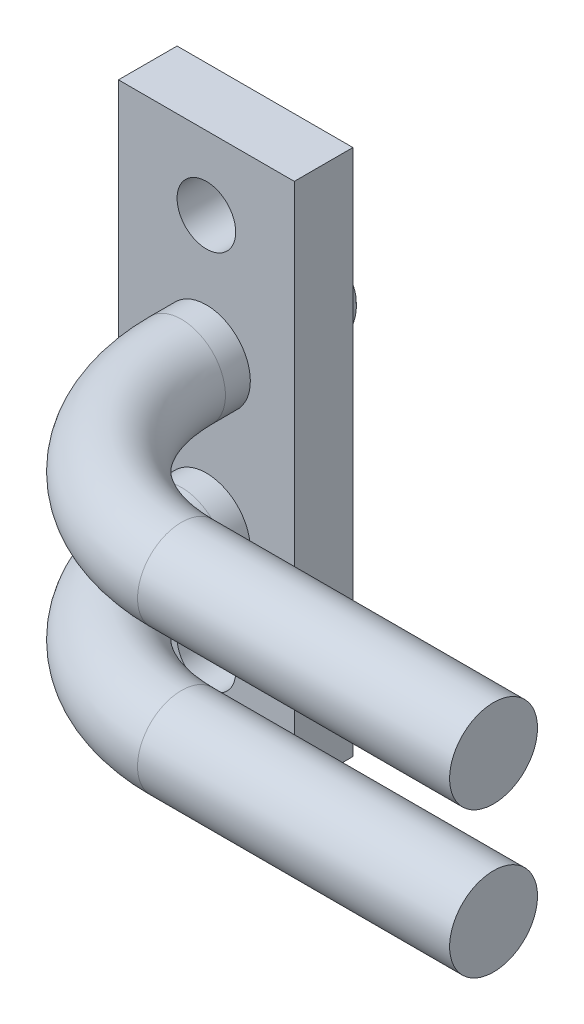
ISO-10303-21;
HEADER;
FILE_DESCRIPTION(('STEP AP214'),'2;1');
FILE_NAME('part.step','',(''),(''),'','','');
FILE_SCHEMA(('AUTOMOTIVE_DESIGN { 1 0 10303 214 1 1 1 1 }'));
ENDSEC;
DATA;
#1=APPLICATION_CONTEXT('core data for automotive mechanical design processes');
#2=APPLICATION_PROTOCOL_DEFINITION('international standard','automotive_design',2000,#1);
#3=PRODUCT_CONTEXT('',#1,'mechanical');
#4=PRODUCT('Part','Part','',(#3));
#5=PRODUCT_RELATED_PRODUCT_CATEGORY('part','',(#4));
#6=PRODUCT_DEFINITION_FORMATION('','',#4);
#7=PRODUCT_DEFINITION_CONTEXT('part definition',#1,'design');
#8=PRODUCT_DEFINITION('design','',#6,#7);
#9=PRODUCT_DEFINITION_SHAPE('','',#8);
#10=(LENGTH_UNIT() NAMED_UNIT(*) SI_UNIT(.MILLI.,.METRE.));
#11=(NAMED_UNIT(*) PLANE_ANGLE_UNIT() SI_UNIT($,.RADIAN.));
#12=(NAMED_UNIT(*) SI_UNIT($,.STERADIAN.) SOLID_ANGLE_UNIT());
#13=UNCERTAINTY_MEASURE_WITH_UNIT(LENGTH_MEASURE(1.E-05),#10,'distance_accuracy_value','');
#14=(GEOMETRIC_REPRESENTATION_CONTEXT(3) GLOBAL_UNCERTAINTY_ASSIGNED_CONTEXT((#13)) GLOBAL_UNIT_ASSIGNED_CONTEXT((#10,
#11,#12)) REPRESENTATION_CONTEXT('',''));
#15=CARTESIAN_POINT('',(0.,0.,0.));
#16=DIRECTION('',(0.,0.,1.));
#17=DIRECTION('',(1.,0.,0.));
#18=AXIS2_PLACEMENT_3D('',#15,#16,#17);
#19=CARTESIAN_POINT('',(3.,9.,2.));
#20=DIRECTION('',(0.,0.,-1.));
#21=DIRECTION('',(-1.,0.,0.));
#22=AXIS2_PLACEMENT_3D('',#19,#20,#21);
#23=PLANE('',#22);
#24=CARTESIAN_POINT('',(0.,-6.5,2.));
#25=DIRECTION('',(0.,0.,1.));
#26=DIRECTION('',(-1.,0.,0.));
#27=AXIS2_PLACEMENT_3D('',#24,#25,#26);
#28=CIRCLE('',#27,1.);
#29=CARTESIAN_POINT('',(-0.999999999999992,-6.5,2.));
#30=VERTEX_POINT('',#29);
#31=EDGE_CURVE('E130',#30,#30,#28,.T.);
#32=ORIENTED_EDGE('',*,*,#31,.F.);
#33=EDGE_LOOP('',(#32));
#34=FACE_BOUND('',#33,.T.);
#35=CARTESIAN_POINT('',(0.,6.5,2.));
#36=DIRECTION('',(0.,0.,1.));
#37=DIRECTION('',(1.,0.,0.));
#38=AXIS2_PLACEMENT_3D('',#35,#36,#37);
#39=CIRCLE('',#38,1.);
#40=CARTESIAN_POINT('',(1.,6.5,2.));
#41=VERTEX_POINT('',#40);
#42=EDGE_CURVE('E119',#41,#41,#39,.T.);
#43=ORIENTED_EDGE('',*,*,#42,.F.);
#44=EDGE_LOOP('',(#43));
#45=FACE_BOUND('',#44,.T.);
#46=CARTESIAN_POINT('',(0.,-2.62,2.));
#47=DIRECTION('',(0.,0.,1.));
#48=DIRECTION('',(1.,0.,0.));
#49=AXIS2_PLACEMENT_3D('',#46,#47,#48);
#50=CIRCLE('',#49,1.5);
#51=CARTESIAN_POINT('',(1.5,-2.62,2.));
#52=VERTEX_POINT('',#51);
#53=EDGE_CURVE('E41',#52,#52,#50,.T.);
#54=ORIENTED_EDGE('',*,*,#53,.F.);
#55=EDGE_LOOP('',(#54));
#56=FACE_BOUND('',#55,.T.);
#57=DIRECTION('',(0.,1.,0.));
#58=VECTOR('',#57,1.);
#59=CARTESIAN_POINT('',(3.,-9.,2.));
#60=LINE('',#59,#58);
#61=CARTESIAN_POINT('',(3.,-9.,2.));
#62=VERTEX_POINT('',#61);
#63=CARTESIAN_POINT('',(3.,9.,2.));
#64=VERTEX_POINT('',#63);
#65=EDGE_CURVE('E86',#62,#64,#60,.T.);
#66=ORIENTED_EDGE('',*,*,#65,.T.);
#67=DIRECTION('',(-1.,0.,0.));
#68=VECTOR('',#67,1.);
#69=CARTESIAN_POINT('',(-3.,9.,2.));
#70=LINE('',#69,#68);
#71=CARTESIAN_POINT('',(-3.,9.,2.));
#72=VERTEX_POINT('',#71);
#73=EDGE_CURVE('E81',#64,#72,#70,.T.);
#74=ORIENTED_EDGE('',*,*,#73,.T.);
#75=DIRECTION('',(0.,-1.,0.));
#76=VECTOR('',#75,1.);
#77=CARTESIAN_POINT('',(-3.,-9.,2.));
#78=LINE('',#77,#76);
#79=CARTESIAN_POINT('',(-3.,-9.,2.));
#80=VERTEX_POINT('',#79);
#81=EDGE_CURVE('E84',#72,#80,#78,.T.);
#82=ORIENTED_EDGE('',*,*,#81,.T.);
#83=DIRECTION('',(1.,0.,0.));
#84=VECTOR('',#83,1.);
#85=CARTESIAN_POINT('',(-3.,-9.,2.));
#86=LINE('',#85,#84);
#87=EDGE_CURVE('E50',#80,#62,#86,.T.);
#88=ORIENTED_EDGE('',*,*,#87,.T.);
#89=EDGE_LOOP('',(#66,#74,#82,#88));
#90=FACE_BOUND('',#89,.T.);
#91=CARTESIAN_POINT('',(0.,2.35,2.));
#92=DIRECTION('',(0.,0.,1.));
#93=DIRECTION('',(1.,0.,0.));
#94=AXIS2_PLACEMENT_3D('',#91,#92,#93);
#95=CIRCLE('',#94,1.5);
#96=CARTESIAN_POINT('',(1.5,2.35,2.));
#97=VERTEX_POINT('',#96);
#98=EDGE_CURVE('E11',#97,#97,#95,.T.);
#99=ORIENTED_EDGE('',*,*,#98,.F.);
#100=EDGE_LOOP('',(#99));
#101=FACE_BOUND('',#100,.T.);
#102=ADVANCED_FACE('F31',(#34,#45,#56,#90,#101),#23,.F.);
#103=CARTESIAN_POINT('',(3.,9.,0.));
#104=DIRECTION('',(0.,0.,-1.));
#105=DIRECTION('',(-1.,0.,0.));
#106=AXIS2_PLACEMENT_3D('',#103,#104,#105);
#107=PLANE('',#106);
#108=CARTESIAN_POINT('',(0.,-6.5,0.));
#109=DIRECTION('',(0.,0.,-1.));
#110=DIRECTION('',(-1.,0.,0.));
#111=AXIS2_PLACEMENT_3D('',#108,#109,#110);
#112=CIRCLE('',#111,1.);
#113=CARTESIAN_POINT('',(-0.999999999999992,-6.5,0.));
#114=VERTEX_POINT('',#113);
#115=EDGE_CURVE('E35',#114,#114,#112,.T.);
#116=ORIENTED_EDGE('',*,*,#115,.F.);
#117=EDGE_LOOP('',(#116));
#118=FACE_BOUND('',#117,.T.);
#119=CARTESIAN_POINT('',(0.,6.5,0.));
#120=DIRECTION('',(0.,0.,-1.));
#121=DIRECTION('',(-1.,0.,0.));
#122=AXIS2_PLACEMENT_3D('',#119,#120,#121);
#123=CIRCLE('',#122,1.);
#124=CARTESIAN_POINT('',(-1.,6.5,0.));
#125=VERTEX_POINT('',#124);
#126=EDGE_CURVE('E116',#125,#125,#123,.T.);
#127=ORIENTED_EDGE('',*,*,#126,.F.);
#128=EDGE_LOOP('',(#127));
#129=FACE_BOUND('',#128,.T.);
#130=CARTESIAN_POINT('',(0.,2.35,0.));
#131=DIRECTION('',(0.,0.,-1.));
#132=DIRECTION('',(-1.,0.,0.));
#133=AXIS2_PLACEMENT_3D('',#130,#131,#132);
#134=CIRCLE('',#133,1.5);
#135=CARTESIAN_POINT('',(-1.5,2.35,0.));
#136=VERTEX_POINT('',#135);
#137=EDGE_CURVE('E104',#136,#136,#134,.T.);
#138=ORIENTED_EDGE('',*,*,#137,.F.);
#139=EDGE_LOOP('',(#138));
#140=FACE_BOUND('',#139,.T.);
#141=DIRECTION('',(0.,1.,0.));
#142=VECTOR('',#141,1.);
#143=CARTESIAN_POINT('',(3.,-9.,0.));
#144=LINE('',#143,#142);
#145=CARTESIAN_POINT('',(3.,-9.,0.));
#146=VERTEX_POINT('',#145);
#147=CARTESIAN_POINT('',(3.,9.,0.));
#148=VERTEX_POINT('',#147);
#149=EDGE_CURVE('E101',#146,#148,#144,.T.);
#150=ORIENTED_EDGE('',*,*,#149,.F.);
#151=DIRECTION('',(1.,0.,0.));
#152=VECTOR('',#151,1.);
#153=CARTESIAN_POINT('',(-3.,-9.,0.));
#154=LINE('',#153,#152);
#155=CARTESIAN_POINT('',(-3.,-9.,0.));
#156=VERTEX_POINT('',#155);
#157=EDGE_CURVE('E73',#156,#146,#154,.T.);
#158=ORIENTED_EDGE('',*,*,#157,.F.);
#159=DIRECTION('',(0.,-1.,0.));
#160=VECTOR('',#159,1.);
#161=CARTESIAN_POINT('',(-3.,-9.,0.));
#162=LINE('',#161,#160);
#163=CARTESIAN_POINT('',(-3.,9.,0.));
#164=VERTEX_POINT('',#163);
#165=EDGE_CURVE('E67',#164,#156,#162,.T.);
#166=ORIENTED_EDGE('',*,*,#165,.F.);
#167=DIRECTION('',(-1.,0.,0.));
#168=VECTOR('',#167,1.);
#169=CARTESIAN_POINT('',(-3.,9.,0.));
#170=LINE('',#169,#168);
#171=EDGE_CURVE('E91',#148,#164,#170,.T.);
#172=ORIENTED_EDGE('',*,*,#171,.F.);
#173=EDGE_LOOP('',(#150,#158,#166,#172));
#174=FACE_BOUND('',#173,.T.);
#175=CARTESIAN_POINT('',(0.,-2.62,0.));
#176=DIRECTION('',(0.,0.,-1.));
#177=DIRECTION('',(-1.,0.,0.));
#178=AXIS2_PLACEMENT_3D('',#175,#176,#177);
#179=CIRCLE('',#178,1.5);
#180=CARTESIAN_POINT('',(-1.5,-2.62,0.));
#181=VERTEX_POINT('',#180);
#182=EDGE_CURVE('E149',#181,#181,#179,.T.);
#183=ORIENTED_EDGE('',*,*,#182,.F.);
#184=EDGE_LOOP('',(#183));
#185=FACE_BOUND('',#184,.T.);
#186=ADVANCED_FACE('F157',(#118,#129,#140,#174,#185),#107,.T.);
#187=CARTESIAN_POINT('',(3.,-9.,2.));
#188=DIRECTION('',(-1.,0.,0.));
#189=DIRECTION('',(0.,0.,1.));
#190=AXIS2_PLACEMENT_3D('',#187,#188,#189);
#191=PLANE('',#190);
#192=ORIENTED_EDGE('',*,*,#149,.T.);
#193=DIRECTION('',(0.,0.,-1.));
#194=VECTOR('',#193,1.);
#195=CARTESIAN_POINT('',(3.,9.,2.));
#196=LINE('',#195,#194);
#197=EDGE_CURVE('E92',#64,#148,#196,.T.);
#198=ORIENTED_EDGE('',*,*,#197,.F.);
#199=ORIENTED_EDGE('',*,*,#65,.F.);
#200=DIRECTION('',(0.,0.,-1.));
#201=VECTOR('',#200,1.);
#202=CARTESIAN_POINT('',(3.,-9.,2.));
#203=LINE('',#202,#201);
#204=EDGE_CURVE('E97',#62,#146,#203,.T.);
#205=ORIENTED_EDGE('',*,*,#204,.T.);
#206=EDGE_LOOP('',(#192,#198,#199,#205));
#207=FACE_BOUND('',#206,.T.);
#208=ADVANCED_FACE('F160',(#207),#191,.F.);
#209=CARTESIAN_POINT('',(-3.,9.,2.));
#210=DIRECTION('',(0.,-1.,0.));
#211=DIRECTION('',(0.,0.,-1.));
#212=AXIS2_PLACEMENT_3D('',#209,#210,#211);
#213=PLANE('',#212);
#214=ORIENTED_EDGE('',*,*,#171,.T.);
#215=DIRECTION('',(0.,0.,-1.));
#216=VECTOR('',#215,1.);
#217=CARTESIAN_POINT('',(-3.,9.,2.));
#218=LINE('',#217,#216);
#219=EDGE_CURVE('E89',#72,#164,#218,.T.);
#220=ORIENTED_EDGE('',*,*,#219,.F.);
#221=ORIENTED_EDGE('',*,*,#73,.F.);
#222=ORIENTED_EDGE('',*,*,#197,.T.);
#223=EDGE_LOOP('',(#214,#220,#221,#222));
#224=FACE_BOUND('',#223,.T.);
#225=ADVANCED_FACE('F90',(#224),#213,.F.);
#226=CARTESIAN_POINT('',(-3.,-9.,2.));
#227=DIRECTION('',(1.,0.,0.));
#228=DIRECTION('',(0.,0.,-1.));
#229=AXIS2_PLACEMENT_3D('',#226,#227,#228);
#230=PLANE('',#229);
#231=ORIENTED_EDGE('',*,*,#165,.T.);
#232=DIRECTION('',(0.,0.,-1.));
#233=VECTOR('',#232,1.);
#234=CARTESIAN_POINT('',(-3.,-9.,2.));
#235=LINE('',#234,#233);
#236=EDGE_CURVE('E93',#80,#156,#235,.T.);
#237=ORIENTED_EDGE('',*,*,#236,.F.);
#238=ORIENTED_EDGE('',*,*,#81,.F.);
#239=ORIENTED_EDGE('',*,*,#219,.T.);
#240=EDGE_LOOP('',(#231,#237,#238,#239));
#241=FACE_BOUND('',#240,.T.);
#242=ADVANCED_FACE('F95',(#241),#230,.F.);
#243=CARTESIAN_POINT('',(-3.,-9.,2.));
#244=DIRECTION('',(0.,1.,0.));
#245=DIRECTION('',(0.,0.,1.));
#246=AXIS2_PLACEMENT_3D('',#243,#244,#245);
#247=PLANE('',#246);
#248=ORIENTED_EDGE('',*,*,#157,.T.);
#249=ORIENTED_EDGE('',*,*,#204,.F.);
#250=ORIENTED_EDGE('',*,*,#87,.F.);
#251=ORIENTED_EDGE('',*,*,#236,.T.);
#252=EDGE_LOOP('',(#248,#249,#250,#251));
#253=FACE_BOUND('',#252,.T.);
#254=ADVANCED_FACE('F177',(#253),#247,.F.);
#255=CARTESIAN_POINT('',(0.,2.35,-2.5));
#256=DIRECTION('',(0.,0.,1.));
#257=DIRECTION('',(1.,0.,0.));
#258=AXIS2_PLACEMENT_3D('',#255,#256,#257);
#259=CYLINDRICAL_SURFACE('',#258,1.5);
#260=CARTESIAN_POINT('',(0.,2.35,-1.));
#261=DIRECTION('',(0.,0.,1.));
#262=DIRECTION('',(1.,0.,0.));
#263=AXIS2_PLACEMENT_3D('',#260,#261,#262);
#264=CIRCLE('',#263,1.5);
#265=CARTESIAN_POINT('',(1.5,2.35,-1.));
#266=VERTEX_POINT('',#265);
#267=EDGE_CURVE('E114',#266,#266,#264,.T.);
#268=ORIENTED_EDGE('',*,*,#267,.T.);
#269=EDGE_LOOP('',(#268));
#270=FACE_BOUND('',#269,.T.);
#271=ORIENTED_EDGE('',*,*,#137,.T.);
#272=EDGE_LOOP('',(#271));
#273=FACE_BOUND('',#272,.T.);
#274=ADVANCED_FACE('F155',(#270,#273),#259,.T.);
#275=CARTESIAN_POINT('',(0.,-2.62,-2.5));
#276=DIRECTION('',(0.,0.,1.));
#277=DIRECTION('',(1.,0.,0.));
#278=AXIS2_PLACEMENT_3D('',#275,#276,#277);
#279=CYLINDRICAL_SURFACE('',#278,1.5);
#280=CARTESIAN_POINT('',(0.,-2.62,-0.6));
#281=DIRECTION('',(0.,0.,1.));
#282=DIRECTION('',(1.,0.,0.));
#283=AXIS2_PLACEMENT_3D('',#280,#281,#282);
#284=CIRCLE('',#283,1.5);
#285=CARTESIAN_POINT('',(1.5,-2.62,-0.6));
#286=VERTEX_POINT('',#285);
#287=EDGE_CURVE('E111',#286,#286,#284,.T.);
#288=ORIENTED_EDGE('',*,*,#287,.T.);
#289=EDGE_LOOP('',(#288));
#290=FACE_BOUND('',#289,.T.);
#291=ORIENTED_EDGE('',*,*,#182,.T.);
#292=EDGE_LOOP('',(#291));
#293=FACE_BOUND('',#292,.T.);
#294=ADVANCED_FACE('F167',(#290,#293),#279,.T.);
#295=CARTESIAN_POINT('',(0.,-2.62,-0.6));
#296=DIRECTION('',(0.,0.,1.));
#297=DIRECTION('',(1.,0.,0.));
#298=AXIS2_PLACEMENT_3D('',#295,#296,#297);
#299=SPHERICAL_SURFACE('',#298,1.5);
#300=ORIENTED_EDGE('',*,*,#287,.F.);
#301=EDGE_LOOP('',(#300));
#302=FACE_BOUND('',#301,.T.);
#303=ADVANCED_FACE('F169',(#302),#299,.T.);
#304=CARTESIAN_POINT('',(0.,2.35,-1.));
#305=DIRECTION('',(0.,0.,1.));
#306=DIRECTION('',(1.,0.,0.));
#307=AXIS2_PLACEMENT_3D('',#304,#305,#306);
#308=SPHERICAL_SURFACE('',#307,1.5);
#309=ORIENTED_EDGE('',*,*,#267,.F.);
#310=EDGE_LOOP('',(#309));
#311=FACE_BOUND('',#310,.T.);
#312=ADVANCED_FACE('F33',(#311),#308,.T.);
#313=CARTESIAN_POINT('',(6.,-2.62,8.85));
#314=DIRECTION('',(1.,0.,0.));
#315=DIRECTION('',(0.,0.,-1.));
#316=AXIS2_PLACEMENT_3D('',#313,#314,#315);
#317=CYLINDRICAL_SURFACE('',#316,1.5);
#318=CARTESIAN_POINT('',(6.,-2.62,8.85));
#319=DIRECTION('',(1.,0.,0.));
#320=DIRECTION('',(0.,0.,-1.));
#321=AXIS2_PLACEMENT_3D('',#318,#319,#320);
#322=CIRCLE('',#321,1.5);
#323=CARTESIAN_POINT('',(6.,-2.62,10.35));
#324=VERTEX_POINT('',#323);
#325=EDGE_CURVE('E141',#324,#324,#322,.T.);
#326=ORIENTED_EDGE('',*,*,#325,.T.);
#327=EDGE_LOOP('',(#326));
#328=FACE_BOUND('',#327,.T.);
#329=CARTESIAN_POINT('',(16.65,-2.62,8.85));
#330=DIRECTION('',(1.,0.,0.));
#331=DIRECTION('',(0.,0.,-1.));
#332=AXIS2_PLACEMENT_3D('',#329,#330,#331);
#333=CIRCLE('',#332,1.5);
#334=CARTESIAN_POINT('',(16.65,-2.62,7.35));
#335=VERTEX_POINT('',#334);
#336=EDGE_CURVE('E146',#335,#335,#333,.T.);
#337=ORIENTED_EDGE('',*,*,#336,.F.);
#338=EDGE_LOOP('',(#337));
#339=FACE_BOUND('',#338,.T.);
#340=ADVANCED_FACE('F237',(#328,#339),#317,.T.);
#341=CARTESIAN_POINT('',(6.,-2.62,2.85));
#342=DIRECTION('',(0.,1.,0.));
#343=DIRECTION('',(0.,0.,1.));
#344=AXIS2_PLACEMENT_3D('',#341,#342,#343);
#345=TOROIDAL_SURFACE('',#344,6.,1.5);
#346=CARTESIAN_POINT('',(0.,-2.62,2.85));
#347=DIRECTION('',(0.,0.,1.));
#348=DIRECTION('',(1.,0.,0.));
#349=AXIS2_PLACEMENT_3D('',#346,#347,#348);
#350=CIRCLE('',#349,1.5);
#351=CARTESIAN_POINT('',(-1.5,-2.62,2.85));
#352=VERTEX_POINT('',#351);
#353=EDGE_CURVE('E138',#352,#352,#350,.T.);
#354=CARTESIAN_POINT('',(6.,-2.62,2.85));
#355=DIRECTION('',(0.,1.,0.));
#356=DIRECTION('',(0.,0.,1.));
#357=AXIS2_PLACEMENT_3D('',#354,#355,#356);
#358=CIRCLE('',#357,7.5);
#359=EDGE_CURVE('',#352,#324,#358,.T.);
#360=ORIENTED_EDGE('',*,*,#353,.T.);
#361=ORIENTED_EDGE('',*,*,#325,.F.);
#362=ORIENTED_EDGE('',*,*,#359,.T.);
#363=ORIENTED_EDGE('',*,*,#359,.F.);
#364=EDGE_LOOP('',(#360,#362,#361,#363));
#365=FACE_BOUND('',#364,.T.);
#366=ADVANCED_FACE('F247',(#365),#345,.T.);
#367=CARTESIAN_POINT('',(0.,-2.62,2.85));
#368=DIRECTION('',(0.,0.,-1.));
#369=DIRECTION('',(-1.,0.,0.));
#370=AXIS2_PLACEMENT_3D('',#367,#368,#369);
#371=CYLINDRICAL_SURFACE('',#370,1.5);
#372=ORIENTED_EDGE('',*,*,#353,.F.);
#373=EDGE_LOOP('',(#372));
#374=FACE_BOUND('',#373,.T.);
#375=ORIENTED_EDGE('',*,*,#53,.T.);
#376=EDGE_LOOP('',(#375));
#377=FACE_BOUND('',#376,.T.);
#378=ADVANCED_FACE('F256',(#374,#377),#371,.T.);
#379=CARTESIAN_POINT('',(16.65,-2.62,8.85));
#380=DIRECTION('',(1.,0.,0.));
#381=DIRECTION('',(0.,0.,-1.));
#382=AXIS2_PLACEMENT_3D('',#379,#380,#381);
#383=PLANE('',#382);
#384=ORIENTED_EDGE('',*,*,#336,.T.);
#385=EDGE_LOOP('',(#384));
#386=FACE_BOUND('',#385,.T.);
#387=ADVANCED_FACE('F266',(#386),#383,.T.);
#388=CARTESIAN_POINT('',(6.,2.35,8.85));
#389=DIRECTION('',(1.,0.,0.));
#390=DIRECTION('',(0.,0.,-1.));
#391=AXIS2_PLACEMENT_3D('',#388,#389,#390);
#392=CYLINDRICAL_SURFACE('',#391,1.5);
#393=CARTESIAN_POINT('',(6.,2.35,8.85));
#394=DIRECTION('',(1.,0.,0.));
#395=DIRECTION('',(0.,0.,-1.));
#396=AXIS2_PLACEMENT_3D('',#393,#394,#395);
#397=CIRCLE('',#396,1.5);
#398=CARTESIAN_POINT('',(6.,2.35,10.35));
#399=VERTEX_POINT('',#398);
#400=EDGE_CURVE('E123',#399,#399,#397,.T.);
#401=ORIENTED_EDGE('',*,*,#400,.T.);
#402=EDGE_LOOP('',(#401));
#403=FACE_BOUND('',#402,.T.);
#404=CARTESIAN_POINT('',(16.65,2.35,8.85));
#405=DIRECTION('',(1.,0.,0.));
#406=DIRECTION('',(0.,0.,-1.));
#407=AXIS2_PLACEMENT_3D('',#404,#405,#406);
#408=CIRCLE('',#407,1.5);
#409=CARTESIAN_POINT('',(16.65,2.35,7.35));
#410=VERTEX_POINT('',#409);
#411=EDGE_CURVE('E135',#410,#410,#408,.T.);
#412=ORIENTED_EDGE('',*,*,#411,.F.);
#413=EDGE_LOOP('',(#412));
#414=FACE_BOUND('',#413,.T.);
#415=ADVANCED_FACE('F276',(#403,#414),#392,.T.);
#416=CARTESIAN_POINT('',(6.,2.35,2.85));
#417=DIRECTION('',(0.,1.,0.));
#418=DIRECTION('',(0.,0.,1.));
#419=AXIS2_PLACEMENT_3D('',#416,#417,#418);
#420=TOROIDAL_SURFACE('',#419,6.,1.5);
#421=CARTESIAN_POINT('',(0.,2.35,2.85));
#422=DIRECTION('',(0.,0.,1.));
#423=DIRECTION('',(1.,0.,0.));
#424=AXIS2_PLACEMENT_3D('',#421,#422,#423);
#425=CIRCLE('',#424,1.5);
#426=CARTESIAN_POINT('',(-1.5,2.35,2.85));
#427=VERTEX_POINT('',#426);
#428=EDGE_CURVE('E118',#427,#427,#425,.T.);
#429=CARTESIAN_POINT('',(6.,2.35,2.85));
#430=DIRECTION('',(0.,1.,0.));
#431=DIRECTION('',(0.,0.,1.));
#432=AXIS2_PLACEMENT_3D('',#429,#430,#431);
#433=CIRCLE('',#432,7.5);
#434=EDGE_CURVE('',#427,#399,#433,.T.);
#435=ORIENTED_EDGE('',*,*,#428,.T.);
#436=ORIENTED_EDGE('',*,*,#400,.F.);
#437=ORIENTED_EDGE('',*,*,#434,.T.);
#438=ORIENTED_EDGE('',*,*,#434,.F.);
#439=EDGE_LOOP('',(#435,#437,#436,#438));
#440=FACE_BOUND('',#439,.T.);
#441=ADVANCED_FACE('F286',(#440),#420,.T.);
#442=CARTESIAN_POINT('',(0.,2.35,2.85));
#443=DIRECTION('',(0.,0.,-1.));
#444=DIRECTION('',(-1.,0.,0.));
#445=AXIS2_PLACEMENT_3D('',#442,#443,#444);
#446=CYLINDRICAL_SURFACE('',#445,1.5);
#447=ORIENTED_EDGE('',*,*,#428,.F.);
#448=EDGE_LOOP('',(#447));
#449=FACE_BOUND('',#448,.T.);
#450=ORIENTED_EDGE('',*,*,#98,.T.);
#451=EDGE_LOOP('',(#450));
#452=FACE_BOUND('',#451,.T.);
#453=ADVANCED_FACE('F296',(#449,#452),#446,.T.);
#454=CARTESIAN_POINT('',(16.65,2.35,8.85));
#455=DIRECTION('',(1.,0.,0.));
#456=DIRECTION('',(0.,0.,-1.));
#457=AXIS2_PLACEMENT_3D('',#454,#455,#456);
#458=PLANE('',#457);
#459=ORIENTED_EDGE('',*,*,#411,.T.);
#460=EDGE_LOOP('',(#459));
#461=FACE_BOUND('',#460,.T.);
#462=ADVANCED_FACE('F306',(#461),#458,.T.);
#463=CARTESIAN_POINT('',(0.,6.5,-2.5));
#464=DIRECTION('',(0.,0.,1.));
#465=DIRECTION('',(1.,0.,0.));
#466=AXIS2_PLACEMENT_3D('',#463,#464,#465);
#467=CYLINDRICAL_SURFACE('',#466,1.);
#468=ORIENTED_EDGE('',*,*,#126,.T.);
#469=EDGE_LOOP('',(#468));
#470=FACE_BOUND('',#469,.T.);
#471=ORIENTED_EDGE('',*,*,#42,.T.);
#472=EDGE_LOOP('',(#471));
#473=FACE_BOUND('',#472,.T.);
#474=ADVANCED_FACE('F315',(#470,#473),#467,.F.);
#475=CARTESIAN_POINT('',(0.,-6.5,-2.5));
#476=DIRECTION('',(0.,0.,1.));
#477=DIRECTION('',(1.,0.,0.));
#478=AXIS2_PLACEMENT_3D('',#475,#476,#477);
#479=CYLINDRICAL_SURFACE('',#478,1.);
#480=ORIENTED_EDGE('',*,*,#115,.T.);
#481=EDGE_LOOP('',(#480));
#482=FACE_BOUND('',#481,.T.);
#483=ORIENTED_EDGE('',*,*,#31,.T.);
#484=EDGE_LOOP('',(#483));
#485=FACE_BOUND('',#484,.T.);
#486=ADVANCED_FACE('F332',(#482,#485),#479,.F.);
#487=CLOSED_SHELL('',(#102,#186,#208,#225,#242,#254,#274,#294,#303,#312,#340,#366,#378,#387,
#415,#441,#453,#462,#474,#486));
#488=MANIFOLD_SOLID_BREP('B2',#487);
#489=ADVANCED_BREP_SHAPE_REPRESENTATION('',(#18,#488),#14);
#490=SHAPE_DEFINITION_REPRESENTATION(#9,#489);
ENDSEC;
END-ISO-10303-21;
